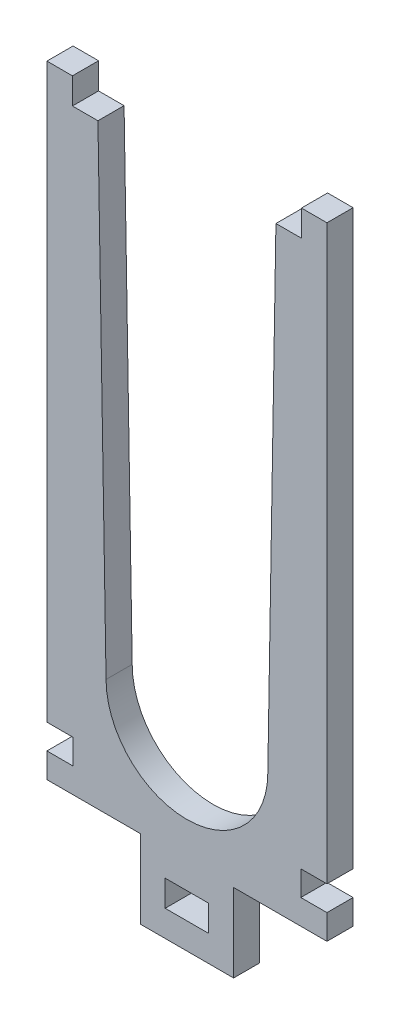
ISO-10303-21;
HEADER;
FILE_DESCRIPTION(('STEP AP214'),'2;1');
FILE_NAME('part.step','',(''),(''),'','','');
FILE_SCHEMA(('AUTOMOTIVE_DESIGN { 1 0 10303 214 1 1 1 1 }'));
ENDSEC;
DATA;
#1=APPLICATION_CONTEXT('core data for automotive mechanical design processes');
#2=APPLICATION_PROTOCOL_DEFINITION('international standard','automotive_design',2000,#1);
#3=PRODUCT_CONTEXT('',#1,'mechanical');
#4=PRODUCT('Part','Part','',(#3));
#5=PRODUCT_RELATED_PRODUCT_CATEGORY('part','',(#4));
#6=PRODUCT_DEFINITION_FORMATION('','',#4);
#7=PRODUCT_DEFINITION_CONTEXT('part definition',#1,'design');
#8=PRODUCT_DEFINITION('design','',#6,#7);
#9=PRODUCT_DEFINITION_SHAPE('','',#8);
#10=(LENGTH_UNIT() NAMED_UNIT(*) SI_UNIT(.MILLI.,.METRE.));
#11=(NAMED_UNIT(*) PLANE_ANGLE_UNIT() SI_UNIT($,.RADIAN.));
#12=(NAMED_UNIT(*) SI_UNIT($,.STERADIAN.) SOLID_ANGLE_UNIT());
#13=UNCERTAINTY_MEASURE_WITH_UNIT(LENGTH_MEASURE(1.E-05),#10,'distance_accuracy_value','');
#14=(GEOMETRIC_REPRESENTATION_CONTEXT(3) GLOBAL_UNCERTAINTY_ASSIGNED_CONTEXT((#13)) GLOBAL_UNIT_ASSIGNED_CONTEXT((#10,
#11,#12)) REPRESENTATION_CONTEXT('',''));
#15=CARTESIAN_POINT('',(0.,0.,0.));
#16=DIRECTION('',(0.,0.,1.));
#17=DIRECTION('',(1.,0.,0.));
#18=AXIS2_PLACEMENT_3D('',#15,#16,#17);
#19=CARTESIAN_POINT('',(57.15,0.,5.334));
#20=DIRECTION('',(-1.,0.,0.));
#21=DIRECTION('',(0.,-1.,0.));
#22=AXIS2_PLACEMENT_3D('',#19,#20,#21);
#23=PLANE('',#22);
#24=DIRECTION('',(0.,1.,0.));
#25=VECTOR('',#24,1.);
#26=CARTESIAN_POINT('',(57.15,0.,5.334));
#27=LINE('',#26,#25);
#28=CARTESIAN_POINT('',(57.15,15.494,5.334));
#29=VERTEX_POINT('',#28);
#30=CARTESIAN_POINT('',(57.15,132.334,5.334));
#31=VERTEX_POINT('',#30);
#32=EDGE_CURVE('E44',#29,#31,#27,.T.);
#33=ORIENTED_EDGE('',*,*,#32,.F.);
#34=DIRECTION('',(0.,0.,-1.));
#35=VECTOR('',#34,1.);
#36=CARTESIAN_POINT('',(57.15,15.494,5.334));
#37=LINE('',#36,#35);
#38=CARTESIAN_POINT('',(57.15,15.494,0.));
#39=VERTEX_POINT('',#38);
#40=EDGE_CURVE('E415',#29,#39,#37,.T.);
#41=ORIENTED_EDGE('',*,*,#40,.T.);
#42=DIRECTION('',(0.,1.,0.));
#43=VECTOR('',#42,1.);
#44=CARTESIAN_POINT('',(57.15,0.,0.));
#45=LINE('',#44,#43);
#46=CARTESIAN_POINT('',(57.15,132.334,0.));
#47=VERTEX_POINT('',#46);
#48=EDGE_CURVE('E309',#39,#47,#45,.T.);
#49=ORIENTED_EDGE('',*,*,#48,.T.);
#50=DIRECTION('',(0.,0.,-1.));
#51=VECTOR('',#50,1.);
#52=CARTESIAN_POINT('',(57.15,132.334,0.));
#53=LINE('',#52,#51);
#54=EDGE_CURVE('E391',#31,#47,#53,.T.);
#55=ORIENTED_EDGE('',*,*,#54,.F.);
#56=EDGE_LOOP('',(#33,#41,#49,#55));
#57=FACE_BOUND('',#56,.T.);
#58=ADVANCED_FACE('F35',(#57),#23,.F.);
#59=CARTESIAN_POINT('',(0.,0.,5.334));
#60=DIRECTION('',(1.,0.,0.));
#61=DIRECTION('',(0.,1.,0.));
#62=AXIS2_PLACEMENT_3D('',#59,#60,#61);
#63=PLANE('',#62);
#64=DIRECTION('',(0.,-1.,0.));
#65=VECTOR('',#64,1.);
#66=CARTESIAN_POINT('',(0.,0.,5.334));
#67=LINE('',#66,#65);
#68=CARTESIAN_POINT('',(0.,10.414,5.334));
#69=VERTEX_POINT('',#68);
#70=CARTESIAN_POINT('',(0.,5.334,5.334));
#71=VERTEX_POINT('',#70);
#72=EDGE_CURVE('E306',#69,#71,#67,.T.);
#73=ORIENTED_EDGE('',*,*,#72,.F.);
#74=DIRECTION('',(0.,0.,-1.));
#75=VECTOR('',#74,1.);
#76=CARTESIAN_POINT('',(0.,10.414,5.334));
#77=LINE('',#76,#75);
#78=CARTESIAN_POINT('',(0.,10.414,0.));
#79=VERTEX_POINT('',#78);
#80=EDGE_CURVE('E319',#69,#79,#77,.T.);
#81=ORIENTED_EDGE('',*,*,#80,.T.);
#82=DIRECTION('',(0.,-1.,0.));
#83=VECTOR('',#82,1.);
#84=CARTESIAN_POINT('',(0.,0.,0.));
#85=LINE('',#84,#83);
#86=CARTESIAN_POINT('',(0.,5.334,0.));
#87=VERTEX_POINT('',#86);
#88=EDGE_CURVE('E298',#79,#87,#85,.T.);
#89=ORIENTED_EDGE('',*,*,#88,.T.);
#90=DIRECTION('',(0.,0.,-1.));
#91=VECTOR('',#90,1.);
#92=CARTESIAN_POINT('',(0.,5.334,0.));
#93=LINE('',#92,#91);
#94=EDGE_CURVE('E261',#71,#87,#93,.T.);
#95=ORIENTED_EDGE('',*,*,#94,.F.);
#96=EDGE_LOOP('',(#73,#81,#89,#95));
#97=FACE_BOUND('',#96,.T.);
#98=ADVANCED_FACE('F318',(#97),#63,.F.);
#99=CARTESIAN_POINT('',(57.15,5.334,0.));
#100=VERTEX_POINT('',#99);
#101=CARTESIAN_POINT('',(57.15,10.414,0.));
#102=VERTEX_POINT('',#101);
#103=EDGE_CURVE('E39',#100,#102,#45,.T.);
#104=ORIENTED_EDGE('',*,*,#103,.T.);
#105=DIRECTION('',(0.,0.,-1.));
#106=VECTOR('',#105,1.);
#107=CARTESIAN_POINT('',(57.15,10.414,5.334));
#108=LINE('',#107,#106);
#109=CARTESIAN_POINT('',(57.15,10.414,5.334));
#110=VERTEX_POINT('',#109);
#111=EDGE_CURVE('E60',#110,#102,#108,.T.);
#112=ORIENTED_EDGE('',*,*,#111,.F.);
#113=CARTESIAN_POINT('',(57.15,5.334,5.334));
#114=VERTEX_POINT('',#113);
#115=EDGE_CURVE('E11',#114,#110,#27,.T.);
#116=ORIENTED_EDGE('',*,*,#115,.F.);
#117=DIRECTION('',(0.,0.,1.));
#118=VECTOR('',#117,1.);
#119=CARTESIAN_POINT('',(57.15,5.334,0.));
#120=LINE('',#119,#118);
#121=EDGE_CURVE('E248',#100,#114,#120,.T.);
#122=ORIENTED_EDGE('',*,*,#121,.F.);
#123=EDGE_LOOP('',(#104,#112,#116,#122));
#124=FACE_BOUND('',#123,.T.);
#125=ADVANCED_FACE('F234',(#124),#23,.F.);
#126=CARTESIAN_POINT('',(0.,132.334,0.));
#127=VERTEX_POINT('',#126);
#128=CARTESIAN_POINT('',(0.,15.494,0.));
#129=VERTEX_POINT('',#128);
#130=EDGE_CURVE('E307',#127,#129,#85,.T.);
#131=ORIENTED_EDGE('',*,*,#130,.T.);
#132=DIRECTION('',(0.,0.,-1.));
#133=VECTOR('',#132,1.);
#134=CARTESIAN_POINT('',(0.,15.494,5.334));
#135=LINE('',#134,#133);
#136=CARTESIAN_POINT('',(0.,15.494,5.334));
#137=VERTEX_POINT('',#136);
#138=EDGE_CURVE('E52',#137,#129,#135,.T.);
#139=ORIENTED_EDGE('',*,*,#138,.F.);
#140=CARTESIAN_POINT('',(0.,132.334,5.334));
#141=VERTEX_POINT('',#140);
#142=EDGE_CURVE('E304',#141,#137,#67,.T.);
#143=ORIENTED_EDGE('',*,*,#142,.F.);
#144=DIRECTION('',(0.,0.,1.));
#145=VECTOR('',#144,1.);
#146=CARTESIAN_POINT('',(0.,132.334,0.));
#147=LINE('',#146,#145);
#148=EDGE_CURVE('E366',#127,#141,#147,.T.);
#149=ORIENTED_EDGE('',*,*,#148,.F.);
#150=EDGE_LOOP('',(#131,#139,#143,#149));
#151=FACE_BOUND('',#150,.T.);
#152=ADVANCED_FACE('F37',(#151),#63,.F.);
#153=CARTESIAN_POINT('',(0.,0.,5.334));
#154=DIRECTION('',(0.,0.,-1.));
#155=DIRECTION('',(-1.,0.,0.));
#156=AXIS2_PLACEMENT_3D('',#153,#154,#155);
#157=PLANE('',#156);
#158=DIRECTION('',(1.,0.,0.));
#159=VECTOR('',#158,1.);
#160=CARTESIAN_POINT('',(33.02,0.,5.334));
#161=LINE('',#160,#159);
#162=CARTESIAN_POINT('',(24.13,0.,5.334));
#163=VERTEX_POINT('',#162);
#164=CARTESIAN_POINT('',(33.02,0.,5.334));
#165=VERTEX_POINT('',#164);
#166=EDGE_CURVE('E461',#163,#165,#161,.T.);
#167=ORIENTED_EDGE('',*,*,#166,.T.);
#168=DIRECTION('',(0.,-1.,0.));
#169=VECTOR('',#168,1.);
#170=CARTESIAN_POINT('',(33.02,0.,5.334));
#171=LINE('',#170,#169);
#172=CARTESIAN_POINT('',(33.02,-5.334,5.334));
#173=VERTEX_POINT('',#172);
#174=EDGE_CURVE('E451',#165,#173,#171,.T.);
#175=ORIENTED_EDGE('',*,*,#174,.T.);
#176=DIRECTION('',(-1.,0.,0.));
#177=VECTOR('',#176,1.);
#178=CARTESIAN_POINT('',(33.02,-5.334,5.334));
#179=LINE('',#178,#177);
#180=CARTESIAN_POINT('',(24.13,-5.334,5.334));
#181=VERTEX_POINT('',#180);
#182=EDGE_CURVE('E454',#173,#181,#179,.T.);
#183=ORIENTED_EDGE('',*,*,#182,.T.);
#184=DIRECTION('',(0.,1.,0.));
#185=VECTOR('',#184,1.);
#186=CARTESIAN_POINT('',(24.13,0.,5.334));
#187=LINE('',#186,#185);
#188=EDGE_CURVE('E458',#181,#163,#187,.T.);
#189=ORIENTED_EDGE('',*,*,#188,.T.);
#190=EDGE_LOOP('',(#167,#175,#183,#189));
#191=FACE_BOUND('',#190,.T.);
#192=DIRECTION('',(0.,1.,0.));
#193=VECTOR('',#192,1.);
#194=CARTESIAN_POINT('',(51.816,10.414,5.334));
#195=LINE('',#194,#193);
#196=CARTESIAN_POINT('',(51.816,10.414,5.334));
#197=VERTEX_POINT('',#196);
#198=CARTESIAN_POINT('',(51.816,15.494,5.334));
#199=VERTEX_POINT('',#198);
#200=EDGE_CURVE('E228',#197,#199,#195,.T.);
#201=ORIENTED_EDGE('',*,*,#200,.T.);
#202=DIRECTION('',(1.,0.,0.));
#203=VECTOR('',#202,1.);
#204=CARTESIAN_POINT('',(57.15,15.494,5.334));
#205=LINE('',#204,#203);
#206=EDGE_CURVE('E237',#199,#29,#205,.T.);
#207=ORIENTED_EDGE('',*,*,#206,.T.);
#208=ORIENTED_EDGE('',*,*,#32,.T.);
#209=DIRECTION('',(1.,0.,0.));
#210=VECTOR('',#209,1.);
#211=CARTESIAN_POINT('',(46.736,132.334,5.334));
#212=LINE('',#211,#210);
#213=CARTESIAN_POINT('',(51.943,132.334,5.334));
#214=VERTEX_POINT('',#213);
#215=EDGE_CURVE('E388',#214,#31,#212,.T.);
#216=ORIENTED_EDGE('',*,*,#215,.F.);
#217=DIRECTION('',(0.,1.,0.));
#218=VECTOR('',#217,1.);
#219=CARTESIAN_POINT('',(51.943,127.,5.334));
#220=LINE('',#219,#218);
#221=CARTESIAN_POINT('',(51.943,127.,5.334));
#222=VERTEX_POINT('',#221);
#223=EDGE_CURVE('E376',#222,#214,#220,.T.);
#224=ORIENTED_EDGE('',*,*,#223,.F.);
#225=DIRECTION('',(1.,0.,0.));
#226=VECTOR('',#225,1.);
#227=CARTESIAN_POINT('',(46.736,127.,5.334));
#228=LINE('',#227,#226);
#229=CARTESIAN_POINT('',(46.736,127.,5.334));
#230=VERTEX_POINT('',#229);
#231=EDGE_CURVE('E368',#230,#222,#228,.T.);
#232=ORIENTED_EDGE('',*,*,#231,.F.);
#233=DIRECTION('',(-0.0169080241525073,-0.999857049142155,0.));
#234=VECTOR('',#233,1.);
#235=CARTESIAN_POINT('',(44.5756269461976,-0.753793532451566,5.334));
#236=LINE('',#235,#234);
#237=CARTESIAN_POINT('',(45.0801802982121,29.083,5.334));
#238=VERTEX_POINT('',#237);
#239=EDGE_CURVE('E281',#230,#238,#236,.T.);
#240=ORIENTED_EDGE('',*,*,#239,.T.);
#241=CARTESIAN_POINT('',(28.575,29.083,5.334));
#242=DIRECTION('',(0.,0.,1.));
#243=DIRECTION('',(1.,0.,0.));
#244=AXIS2_PLACEMENT_3D('',#241,#242,#243);
#245=CIRCLE('',#244,16.5051802982121);
#246=CARTESIAN_POINT('',(12.0698197017879,29.083,5.334));
#247=VERTEX_POINT('',#246);
#248=EDGE_CURVE('E290',#247,#238,#245,.T.);
#249=ORIENTED_EDGE('',*,*,#248,.F.);
#250=DIRECTION('',(0.0169080241525077,-0.999857049142155,0.));
#251=VECTOR('',#250,1.);
#252=CARTESIAN_POINT('',(12.5580349386081,0.212361915367997,5.334));
#253=LINE('',#252,#251);
#254=CARTESIAN_POINT('',(10.414,127.,5.334));
#255=VERTEX_POINT('',#254);
#256=EDGE_CURVE('E259',#255,#247,#253,.T.);
#257=ORIENTED_EDGE('',*,*,#256,.F.);
#258=DIRECTION('',(1.,0.,0.));
#259=VECTOR('',#258,1.);
#260=CARTESIAN_POINT('',(10.414,127.,5.334));
#261=LINE('',#260,#259);
#262=CARTESIAN_POINT('',(5.20699999999999,127.,5.334));
#263=VERTEX_POINT('',#262);
#264=EDGE_CURVE('E358',#263,#255,#261,.T.);
#265=ORIENTED_EDGE('',*,*,#264,.F.);
#266=DIRECTION('',(0.,1.,0.));
#267=VECTOR('',#266,1.);
#268=CARTESIAN_POINT('',(5.20699999999999,127.,5.334));
#269=LINE('',#268,#267);
#270=CARTESIAN_POINT('',(5.20699999999999,132.334,5.334));
#271=VERTEX_POINT('',#270);
#272=EDGE_CURVE('E363',#263,#271,#269,.T.);
#273=ORIENTED_EDGE('',*,*,#272,.T.);
#274=DIRECTION('',(1.,0.,0.));
#275=VECTOR('',#274,1.);
#276=CARTESIAN_POINT('',(0.,132.334,5.334));
#277=LINE('',#276,#275);
#278=EDGE_CURVE('E383',#141,#271,#277,.T.);
#279=ORIENTED_EDGE('',*,*,#278,.F.);
#280=ORIENTED_EDGE('',*,*,#142,.T.);
#281=DIRECTION('',(1.,0.,0.));
#282=VECTOR('',#281,1.);
#283=CARTESIAN_POINT('',(0.,15.494,5.334));
#284=LINE('',#283,#282);
#285=CARTESIAN_POINT('',(5.334,15.494,5.334));
#286=VERTEX_POINT('',#285);
#287=EDGE_CURVE('E431',#137,#286,#284,.T.);
#288=ORIENTED_EDGE('',*,*,#287,.T.);
#289=DIRECTION('',(0.,-1.,0.));
#290=VECTOR('',#289,1.);
#291=CARTESIAN_POINT('',(5.334,10.414,5.334));
#292=LINE('',#291,#290);
#293=CARTESIAN_POINT('',(5.334,10.414,5.334));
#294=VERTEX_POINT('',#293);
#295=EDGE_CURVE('E435',#286,#294,#292,.T.);
#296=ORIENTED_EDGE('',*,*,#295,.T.);
#297=DIRECTION('',(-1.,0.,0.));
#298=VECTOR('',#297,1.);
#299=CARTESIAN_POINT('',(0.,10.414,5.334));
#300=LINE('',#299,#298);
#301=EDGE_CURVE('E428',#294,#69,#300,.T.);
#302=ORIENTED_EDGE('',*,*,#301,.T.);
#303=ORIENTED_EDGE('',*,*,#72,.T.);
#304=DIRECTION('',(-1.,0.,0.));
#305=VECTOR('',#304,1.);
#306=CARTESIAN_POINT('',(0.,5.334,5.334));
#307=LINE('',#306,#305);
#308=CARTESIAN_POINT('',(19.05,5.334,5.334));
#309=VERTEX_POINT('',#308);
#310=EDGE_CURVE('E271',#309,#71,#307,.T.);
#311=ORIENTED_EDGE('',*,*,#310,.F.);
#312=DIRECTION('',(0.,-1.,0.));
#313=VECTOR('',#312,1.);
#314=CARTESIAN_POINT('',(19.05,5.334,5.334));
#315=LINE('',#314,#313);
#316=CARTESIAN_POINT('',(19.05,-10.668,5.334));
#317=VERTEX_POINT('',#316);
#318=EDGE_CURVE('E252',#309,#317,#315,.T.);
#319=ORIENTED_EDGE('',*,*,#318,.T.);
#320=DIRECTION('',(-1.,0.,0.));
#321=VECTOR('',#320,1.);
#322=CARTESIAN_POINT('',(38.1,-10.668,5.334));
#323=LINE('',#322,#321);
#324=CARTESIAN_POINT('',(38.1,-10.668,5.334));
#325=VERTEX_POINT('',#324);
#326=EDGE_CURVE('E343',#325,#317,#323,.T.);
#327=ORIENTED_EDGE('',*,*,#326,.F.);
#328=DIRECTION('',(0.,-1.,0.));
#329=VECTOR('',#328,1.);
#330=CARTESIAN_POINT('',(38.1,5.334,5.334));
#331=LINE('',#330,#329);
#332=CARTESIAN_POINT('',(38.1,5.334,5.334));
#333=VERTEX_POINT('',#332);
#334=EDGE_CURVE('E245',#333,#325,#331,.T.);
#335=ORIENTED_EDGE('',*,*,#334,.F.);
#336=DIRECTION('',(-1.,0.,0.));
#337=VECTOR('',#336,1.);
#338=CARTESIAN_POINT('',(57.15,5.334,5.334));
#339=LINE('',#338,#337);
#340=EDGE_CURVE('E243',#114,#333,#339,.T.);
#341=ORIENTED_EDGE('',*,*,#340,.F.);
#342=ORIENTED_EDGE('',*,*,#115,.T.);
#343=DIRECTION('',(-1.,0.,0.));
#344=VECTOR('',#343,1.);
#345=CARTESIAN_POINT('',(57.15,10.414,5.334));
#346=LINE('',#345,#344);
#347=EDGE_CURVE('E222',#110,#197,#346,.T.);
#348=ORIENTED_EDGE('',*,*,#347,.T.);
#349=EDGE_LOOP('',(#201,#207,#208,#216,#224,#232,#240,#249,#257,#265,#273,#279,#280,#288,#296,
#302,#303,#311,#319,#327,#335,#341,#342,#348));
#350=FACE_BOUND('',#349,.T.);
#351=ADVANCED_FACE('F240',(#191,#350),#157,.F.);
#352=CARTESIAN_POINT('',(0.,0.,0.));
#353=DIRECTION('',(0.,0.,-1.));
#354=DIRECTION('',(-1.,0.,0.));
#355=AXIS2_PLACEMENT_3D('',#352,#353,#354);
#356=PLANE('',#355);
#357=DIRECTION('',(1.,0.,0.));
#358=VECTOR('',#357,1.);
#359=CARTESIAN_POINT('',(57.15,15.494,0.));
#360=LINE('',#359,#358);
#361=CARTESIAN_POINT('',(51.816,15.494,0.));
#362=VERTEX_POINT('',#361);
#363=EDGE_CURVE('E229',#362,#39,#360,.T.);
#364=ORIENTED_EDGE('',*,*,#363,.F.);
#365=DIRECTION('',(0.,1.,0.));
#366=VECTOR('',#365,1.);
#367=CARTESIAN_POINT('',(51.816,10.414,0.));
#368=LINE('',#367,#366);
#369=CARTESIAN_POINT('',(51.816,10.414,0.));
#370=VERTEX_POINT('',#369);
#371=EDGE_CURVE('E619',#370,#362,#368,.T.);
#372=ORIENTED_EDGE('',*,*,#371,.F.);
#373=DIRECTION('',(-1.,0.,0.));
#374=VECTOR('',#373,1.);
#375=CARTESIAN_POINT('',(57.15,10.414,0.));
#376=LINE('',#375,#374);
#377=EDGE_CURVE('E446',#102,#370,#376,.T.);
#378=ORIENTED_EDGE('',*,*,#377,.F.);
#379=ORIENTED_EDGE('',*,*,#103,.F.);
#380=DIRECTION('',(1.,0.,0.));
#381=VECTOR('',#380,1.);
#382=CARTESIAN_POINT('',(57.15,5.334,0.));
#383=LINE('',#382,#381);
#384=CARTESIAN_POINT('',(38.1,5.334,0.));
#385=VERTEX_POINT('',#384);
#386=EDGE_CURVE('E250',#385,#100,#383,.T.);
#387=ORIENTED_EDGE('',*,*,#386,.F.);
#388=DIRECTION('',(0.,-1.,0.));
#389=VECTOR('',#388,1.);
#390=CARTESIAN_POINT('',(38.1,5.334,0.));
#391=LINE('',#390,#389);
#392=CARTESIAN_POINT('',(38.1,-10.668,0.));
#393=VERTEX_POINT('',#392);
#394=EDGE_CURVE('E257',#385,#393,#391,.T.);
#395=ORIENTED_EDGE('',*,*,#394,.T.);
#396=DIRECTION('',(1.,0.,0.));
#397=VECTOR('',#396,1.);
#398=CARTESIAN_POINT('',(38.1,-10.668,0.));
#399=LINE('',#398,#397);
#400=CARTESIAN_POINT('',(19.05,-10.668,0.));
#401=VERTEX_POINT('',#400);
#402=EDGE_CURVE('E332',#401,#393,#399,.T.);
#403=ORIENTED_EDGE('',*,*,#402,.F.);
#404=DIRECTION('',(0.,-1.,0.));
#405=VECTOR('',#404,1.);
#406=CARTESIAN_POINT('',(19.05,5.334,0.));
#407=LINE('',#406,#405);
#408=CARTESIAN_POINT('',(19.05,5.334,0.));
#409=VERTEX_POINT('',#408);
#410=EDGE_CURVE('E274',#409,#401,#407,.T.);
#411=ORIENTED_EDGE('',*,*,#410,.F.);
#412=DIRECTION('',(1.,0.,0.));
#413=VECTOR('',#412,1.);
#414=CARTESIAN_POINT('',(0.,5.334,0.));
#415=LINE('',#414,#413);
#416=EDGE_CURVE('E264',#87,#409,#415,.T.);
#417=ORIENTED_EDGE('',*,*,#416,.F.);
#418=ORIENTED_EDGE('',*,*,#88,.F.);
#419=DIRECTION('',(-1.,0.,0.));
#420=VECTOR('',#419,1.);
#421=CARTESIAN_POINT('',(0.,10.414,0.));
#422=LINE('',#421,#420);
#423=CARTESIAN_POINT('',(5.334,10.414,0.));
#424=VERTEX_POINT('',#423);
#425=EDGE_CURVE('E438',#424,#79,#422,.T.);
#426=ORIENTED_EDGE('',*,*,#425,.F.);
#427=DIRECTION('',(0.,-1.,0.));
#428=VECTOR('',#427,1.);
#429=CARTESIAN_POINT('',(5.334,10.414,0.));
#430=LINE('',#429,#428);
#431=CARTESIAN_POINT('',(5.334,15.494,0.));
#432=VERTEX_POINT('',#431);
#433=EDGE_CURVE('E432',#432,#424,#430,.T.);
#434=ORIENTED_EDGE('',*,*,#433,.F.);
#435=DIRECTION('',(1.,0.,0.));
#436=VECTOR('',#435,1.);
#437=CARTESIAN_POINT('',(0.,15.494,0.));
#438=LINE('',#437,#436);
#439=EDGE_CURVE('E440',#129,#432,#438,.T.);
#440=ORIENTED_EDGE('',*,*,#439,.F.);
#441=ORIENTED_EDGE('',*,*,#130,.F.);
#442=DIRECTION('',(-1.,0.,0.));
#443=VECTOR('',#442,1.);
#444=CARTESIAN_POINT('',(0.,132.334,0.));
#445=LINE('',#444,#443);
#446=CARTESIAN_POINT('',(5.20699999999999,132.334,0.));
#447=VERTEX_POINT('',#446);
#448=EDGE_CURVE('E386',#447,#127,#445,.T.);
#449=ORIENTED_EDGE('',*,*,#448,.F.);
#450=DIRECTION('',(0.,1.,0.));
#451=VECTOR('',#450,1.);
#452=CARTESIAN_POINT('',(5.20699999999999,127.,0.));
#453=LINE('',#452,#451);
#454=CARTESIAN_POINT('',(5.20699999999999,127.,0.));
#455=VERTEX_POINT('',#454);
#456=EDGE_CURVE('E360',#455,#447,#453,.T.);
#457=ORIENTED_EDGE('',*,*,#456,.F.);
#458=DIRECTION('',(-1.,0.,0.));
#459=VECTOR('',#458,1.);
#460=CARTESIAN_POINT('',(10.414,127.,0.));
#461=LINE('',#460,#459);
#462=CARTESIAN_POINT('',(10.414,127.,0.));
#463=VERTEX_POINT('',#462);
#464=EDGE_CURVE('E351',#463,#455,#461,.T.);
#465=ORIENTED_EDGE('',*,*,#464,.F.);
#466=DIRECTION('',(0.0169080241525077,-0.999857049142155,0.));
#467=VECTOR('',#466,1.);
#468=CARTESIAN_POINT('',(12.5580349386081,0.212361915367997,0.));
#469=LINE('',#468,#467);
#470=CARTESIAN_POINT('',(12.0698197017879,29.083,0.));
#471=VERTEX_POINT('',#470);
#472=EDGE_CURVE('E277',#463,#471,#469,.T.);
#473=ORIENTED_EDGE('',*,*,#472,.T.);
#474=CARTESIAN_POINT('',(28.575,29.083,0.));
#475=DIRECTION('',(0.,0.,1.));
#476=DIRECTION('',(1.,0.,0.));
#477=AXIS2_PLACEMENT_3D('',#474,#475,#476);
#478=CIRCLE('',#477,16.5051802982121);
#479=CARTESIAN_POINT('',(45.0801802982121,29.083,0.));
#480=VERTEX_POINT('',#479);
#481=EDGE_CURVE('E280',#471,#480,#478,.T.);
#482=ORIENTED_EDGE('',*,*,#481,.T.);
#483=DIRECTION('',(-0.0169080241525073,-0.999857049142155,0.));
#484=VECTOR('',#483,1.);
#485=CARTESIAN_POINT('',(44.5756269461976,-0.753793532451566,0.));
#486=LINE('',#485,#484);
#487=CARTESIAN_POINT('',(46.736,127.,0.));
#488=VERTEX_POINT('',#487);
#489=EDGE_CURVE('E284',#488,#480,#486,.T.);
#490=ORIENTED_EDGE('',*,*,#489,.F.);
#491=DIRECTION('',(-1.,0.,0.));
#492=VECTOR('',#491,1.);
#493=CARTESIAN_POINT('',(46.736,127.,0.));
#494=LINE('',#493,#492);
#495=CARTESIAN_POINT('',(51.943,127.,0.));
#496=VERTEX_POINT('',#495);
#497=EDGE_CURVE('E374',#496,#488,#494,.T.);
#498=ORIENTED_EDGE('',*,*,#497,.F.);
#499=DIRECTION('',(0.,1.,0.));
#500=VECTOR('',#499,1.);
#501=CARTESIAN_POINT('',(51.943,127.,0.));
#502=LINE('',#501,#500);
#503=CARTESIAN_POINT('',(51.943,132.334,0.));
#504=VERTEX_POINT('',#503);
#505=EDGE_CURVE('E362',#496,#504,#502,.T.);
#506=ORIENTED_EDGE('',*,*,#505,.T.);
#507=DIRECTION('',(-1.,0.,0.));
#508=VECTOR('',#507,1.);
#509=CARTESIAN_POINT('',(46.736,132.334,0.));
#510=LINE('',#509,#508);
#511=EDGE_CURVE('E265',#47,#504,#510,.T.);
#512=ORIENTED_EDGE('',*,*,#511,.F.);
#513=ORIENTED_EDGE('',*,*,#48,.F.);
#514=EDGE_LOOP('',(#364,#372,#378,#379,#387,#395,#403,#411,#417,#418,#426,#434,#440,#441,#449,
#457,#465,#473,#482,#490,#498,#506,#512,#513));
#515=FACE_BOUND('',#514,.T.);
#516=DIRECTION('',(0.,-1.,0.));
#517=VECTOR('',#516,1.);
#518=CARTESIAN_POINT('',(33.02,0.,0.));
#519=LINE('',#518,#517);
#520=CARTESIAN_POINT('',(33.02,0.,0.));
#521=VERTEX_POINT('',#520);
#522=CARTESIAN_POINT('',(33.02,-5.334,0.));
#523=VERTEX_POINT('',#522);
#524=EDGE_CURVE('E418',#521,#523,#519,.T.);
#525=ORIENTED_EDGE('',*,*,#524,.F.);
#526=DIRECTION('',(1.,0.,0.));
#527=VECTOR('',#526,1.);
#528=CARTESIAN_POINT('',(33.02,0.,0.));
#529=LINE('',#528,#527);
#530=CARTESIAN_POINT('',(24.13,0.,0.));
#531=VERTEX_POINT('',#530);
#532=EDGE_CURVE('E455',#531,#521,#529,.T.);
#533=ORIENTED_EDGE('',*,*,#532,.F.);
#534=DIRECTION('',(0.,1.,0.));
#535=VECTOR('',#534,1.);
#536=CARTESIAN_POINT('',(24.13,0.,0.));
#537=LINE('',#536,#535);
#538=CARTESIAN_POINT('',(24.13,-5.334,0.));
#539=VERTEX_POINT('',#538);
#540=EDGE_CURVE('E467',#539,#531,#537,.T.);
#541=ORIENTED_EDGE('',*,*,#540,.F.);
#542=DIRECTION('',(-1.,0.,0.));
#543=VECTOR('',#542,1.);
#544=CARTESIAN_POINT('',(33.02,-5.334,0.));
#545=LINE('',#544,#543);
#546=EDGE_CURVE('E421',#523,#539,#545,.T.);
#547=ORIENTED_EDGE('',*,*,#546,.F.);
#548=EDGE_LOOP('',(#525,#533,#541,#547));
#549=FACE_BOUND('',#548,.T.);
#550=ADVANCED_FACE('F328',(#515,#549),#356,.T.);
#551=CARTESIAN_POINT('',(12.5580349386081,0.212361915367997,0.));
#552=DIRECTION('',(-0.999857049142155,-0.0169080241525077,0.));
#553=DIRECTION('',(0.0169080241525077,-0.999857049142155,0.));
#554=AXIS2_PLACEMENT_3D('',#551,#552,#553);
#555=PLANE('',#554);
#556=ORIENTED_EDGE('',*,*,#256,.T.);
#557=DIRECTION('',(0.,0.,1.));
#558=VECTOR('',#557,1.);
#559=CARTESIAN_POINT('',(12.0698197017879,29.083,0.));
#560=LINE('',#559,#558);
#561=EDGE_CURVE('E287',#471,#247,#560,.T.);
#562=ORIENTED_EDGE('',*,*,#561,.F.);
#563=ORIENTED_EDGE('',*,*,#472,.F.);
#564=DIRECTION('',(0.,0.,1.));
#565=VECTOR('',#564,1.);
#566=CARTESIAN_POINT('',(10.414,127.,0.));
#567=LINE('',#566,#565);
#568=EDGE_CURVE('E295',#463,#255,#567,.T.);
#569=ORIENTED_EDGE('',*,*,#568,.T.);
#570=EDGE_LOOP('',(#556,#562,#563,#569));
#571=FACE_BOUND('',#570,.T.);
#572=ADVANCED_FACE('F519',(#571),#555,.F.);
#573=CARTESIAN_POINT('',(44.5756269461976,-0.753793532451566,0.));
#574=DIRECTION('',(-0.999857049142155,0.0169080241525073,0.));
#575=DIRECTION('',(-0.0169080241525073,-0.999857049142155,0.));
#576=AXIS2_PLACEMENT_3D('',#573,#574,#575);
#577=PLANE('',#576);
#578=ORIENTED_EDGE('',*,*,#239,.F.);
#579=DIRECTION('',(0.,0.,1.));
#580=VECTOR('',#579,1.);
#581=CARTESIAN_POINT('',(46.736,127.,0.));
#582=LINE('',#581,#580);
#583=EDGE_CURVE('E299',#488,#230,#582,.T.);
#584=ORIENTED_EDGE('',*,*,#583,.F.);
#585=ORIENTED_EDGE('',*,*,#489,.T.);
#586=DIRECTION('',(0.,0.,1.));
#587=VECTOR('',#586,1.);
#588=CARTESIAN_POINT('',(45.0801802982121,29.083,0.));
#589=LINE('',#588,#587);
#590=EDGE_CURVE('E301',#480,#238,#589,.T.);
#591=ORIENTED_EDGE('',*,*,#590,.T.);
#592=EDGE_LOOP('',(#578,#584,#585,#591));
#593=FACE_BOUND('',#592,.T.);
#594=ADVANCED_FACE('F523',(#593),#577,.T.);
#595=CARTESIAN_POINT('',(28.575,29.083,0.));
#596=DIRECTION('',(0.,0.,1.));
#597=DIRECTION('',(1.,0.,0.));
#598=AXIS2_PLACEMENT_3D('',#595,#596,#597);
#599=CYLINDRICAL_SURFACE('',#598,16.5051802982121);
#600=ORIENTED_EDGE('',*,*,#248,.T.);
#601=ORIENTED_EDGE('',*,*,#590,.F.);
#602=ORIENTED_EDGE('',*,*,#481,.F.);
#603=ORIENTED_EDGE('',*,*,#561,.T.);
#604=EDGE_LOOP('',(#600,#601,#602,#603));
#605=FACE_BOUND('',#604,.T.);
#606=ADVANCED_FACE('F525',(#605),#599,.F.);
#607=CARTESIAN_POINT('',(19.05,5.334,0.));
#608=DIRECTION('',(1.,0.,0.));
#609=DIRECTION('',(0.,0.,-1.));
#610=AXIS2_PLACEMENT_3D('',#607,#608,#609);
#611=PLANE('',#610);
#612=ORIENTED_EDGE('',*,*,#410,.T.);
#613=DIRECTION('',(0.,0.,-1.));
#614=VECTOR('',#613,1.);
#615=CARTESIAN_POINT('',(19.05,-10.668,0.));
#616=LINE('',#615,#614);
#617=EDGE_CURVE('E337',#317,#401,#616,.T.);
#618=ORIENTED_EDGE('',*,*,#617,.F.);
#619=ORIENTED_EDGE('',*,*,#318,.F.);
#620=DIRECTION('',(0.,0.,1.));
#621=VECTOR('',#620,1.);
#622=CARTESIAN_POINT('',(19.05,5.334,0.));
#623=LINE('',#622,#621);
#624=EDGE_CURVE('E268',#409,#309,#623,.T.);
#625=ORIENTED_EDGE('',*,*,#624,.F.);
#626=EDGE_LOOP('',(#612,#618,#619,#625));
#627=FACE_BOUND('',#626,.T.);
#628=ADVANCED_FACE('F336',(#627),#611,.F.);
#629=CARTESIAN_POINT('',(0.,5.334,0.));
#630=DIRECTION('',(0.,1.,0.));
#631=DIRECTION('',(0.,0.,1.));
#632=AXIS2_PLACEMENT_3D('',#629,#630,#631);
#633=PLANE('',#632);
#634=ORIENTED_EDGE('',*,*,#94,.T.);
#635=ORIENTED_EDGE('',*,*,#416,.T.);
#636=ORIENTED_EDGE('',*,*,#624,.T.);
#637=ORIENTED_EDGE('',*,*,#310,.T.);
#638=EDGE_LOOP('',(#634,#635,#636,#637));
#639=FACE_BOUND('',#638,.T.);
#640=ADVANCED_FACE('F324',(#639),#633,.F.);
#641=CARTESIAN_POINT('',(38.1,5.334,0.));
#642=DIRECTION('',(-1.,0.,0.));
#643=DIRECTION('',(0.,0.,1.));
#644=AXIS2_PLACEMENT_3D('',#641,#642,#643);
#645=PLANE('',#644);
#646=ORIENTED_EDGE('',*,*,#334,.T.);
#647=DIRECTION('',(0.,0.,1.));
#648=VECTOR('',#647,1.);
#649=CARTESIAN_POINT('',(38.1,-10.668,0.));
#650=LINE('',#649,#648);
#651=EDGE_CURVE('E347',#393,#325,#650,.T.);
#652=ORIENTED_EDGE('',*,*,#651,.F.);
#653=ORIENTED_EDGE('',*,*,#394,.F.);
#654=DIRECTION('',(0.,0.,-1.));
#655=VECTOR('',#654,1.);
#656=CARTESIAN_POINT('',(38.1,5.334,0.));
#657=LINE('',#656,#655);
#658=EDGE_CURVE('E247',#333,#385,#657,.T.);
#659=ORIENTED_EDGE('',*,*,#658,.F.);
#660=EDGE_LOOP('',(#646,#652,#653,#659));
#661=FACE_BOUND('',#660,.T.);
#662=ADVANCED_FACE('F481',(#661),#645,.F.);
#663=CARTESIAN_POINT('',(0.,5.334,0.));
#664=DIRECTION('',(0.,-1.,0.));
#665=DIRECTION('',(0.,0.,-1.));
#666=AXIS2_PLACEMENT_3D('',#663,#664,#665);
#667=PLANE('',#666);
#668=ORIENTED_EDGE('',*,*,#121,.T.);
#669=ORIENTED_EDGE('',*,*,#340,.T.);
#670=ORIENTED_EDGE('',*,*,#658,.T.);
#671=ORIENTED_EDGE('',*,*,#386,.T.);
#672=EDGE_LOOP('',(#668,#669,#670,#671));
#673=FACE_BOUND('',#672,.T.);
#674=ADVANCED_FACE('F538',(#673),#667,.T.);
#675=CARTESIAN_POINT('',(0.,132.334,0.));
#676=DIRECTION('',(0.,1.,0.));
#677=DIRECTION('',(0.,0.,1.));
#678=AXIS2_PLACEMENT_3D('',#675,#676,#677);
#679=PLANE('',#678);
#680=DIRECTION('',(0.,0.,-1.));
#681=VECTOR('',#680,1.);
#682=CARTESIAN_POINT('',(51.943,132.334,0.));
#683=LINE('',#682,#681);
#684=EDGE_CURVE('E345',#214,#504,#683,.T.);
#685=ORIENTED_EDGE('',*,*,#684,.F.);
#686=ORIENTED_EDGE('',*,*,#215,.T.);
#687=ORIENTED_EDGE('',*,*,#54,.T.);
#688=ORIENTED_EDGE('',*,*,#511,.T.);
#689=EDGE_LOOP('',(#685,#686,#687,#688));
#690=FACE_BOUND('',#689,.T.);
#691=ADVANCED_FACE('F397',(#690),#679,.T.);
#692=CARTESIAN_POINT('',(0.,132.334,0.));
#693=DIRECTION('',(0.,1.,0.));
#694=DIRECTION('',(0.,0.,1.));
#695=AXIS2_PLACEMENT_3D('',#692,#693,#694);
#696=PLANE('',#695);
#697=DIRECTION('',(0.,0.,1.));
#698=VECTOR('',#697,1.);
#699=CARTESIAN_POINT('',(5.20699999999999,132.334,0.));
#700=LINE('',#699,#698);
#701=EDGE_CURVE('E355',#447,#271,#700,.T.);
#702=ORIENTED_EDGE('',*,*,#701,.F.);
#703=ORIENTED_EDGE('',*,*,#448,.T.);
#704=ORIENTED_EDGE('',*,*,#148,.T.);
#705=ORIENTED_EDGE('',*,*,#278,.T.);
#706=EDGE_LOOP('',(#702,#703,#704,#705));
#707=FACE_BOUND('',#706,.T.);
#708=ADVANCED_FACE('F543',(#707),#696,.T.);
#709=CARTESIAN_POINT('',(5.20699999999999,127.,0.));
#710=DIRECTION('',(-1.,0.,0.));
#711=DIRECTION('',(0.,0.,1.));
#712=AXIS2_PLACEMENT_3D('',#709,#710,#711);
#713=PLANE('',#712);
#714=ORIENTED_EDGE('',*,*,#701,.T.);
#715=ORIENTED_EDGE('',*,*,#272,.F.);
#716=DIRECTION('',(0.,0.,1.));
#717=VECTOR('',#716,1.);
#718=CARTESIAN_POINT('',(5.20699999999999,127.,0.));
#719=LINE('',#718,#717);
#720=EDGE_CURVE('E354',#455,#263,#719,.T.);
#721=ORIENTED_EDGE('',*,*,#720,.F.);
#722=ORIENTED_EDGE('',*,*,#456,.T.);
#723=EDGE_LOOP('',(#714,#715,#721,#722));
#724=FACE_BOUND('',#723,.T.);
#725=ADVANCED_FACE('F546',(#724),#713,.F.);
#726=CARTESIAN_POINT('',(0.,127.,0.));
#727=DIRECTION('',(0.,-1.,0.));
#728=DIRECTION('',(0.,0.,-1.));
#729=AXIS2_PLACEMENT_3D('',#726,#727,#728);
#730=PLANE('',#729);
#731=ORIENTED_EDGE('',*,*,#568,.F.);
#732=ORIENTED_EDGE('',*,*,#464,.T.);
#733=ORIENTED_EDGE('',*,*,#720,.T.);
#734=ORIENTED_EDGE('',*,*,#264,.T.);
#735=EDGE_LOOP('',(#731,#732,#733,#734));
#736=FACE_BOUND('',#735,.T.);
#737=ADVANCED_FACE('F550',(#736),#730,.F.);
#738=CARTESIAN_POINT('',(51.943,127.,0.));
#739=DIRECTION('',(1.,0.,0.));
#740=DIRECTION('',(0.,0.,-1.));
#741=AXIS2_PLACEMENT_3D('',#738,#739,#740);
#742=PLANE('',#741);
#743=ORIENTED_EDGE('',*,*,#684,.T.);
#744=ORIENTED_EDGE('',*,*,#505,.F.);
#745=DIRECTION('',(0.,0.,-1.));
#746=VECTOR('',#745,1.);
#747=CARTESIAN_POINT('',(51.943,127.,0.));
#748=LINE('',#747,#746);
#749=EDGE_CURVE('E371',#222,#496,#748,.T.);
#750=ORIENTED_EDGE('',*,*,#749,.F.);
#751=ORIENTED_EDGE('',*,*,#223,.T.);
#752=EDGE_LOOP('',(#743,#744,#750,#751));
#753=FACE_BOUND('',#752,.T.);
#754=ADVANCED_FACE('F404',(#753),#742,.F.);
#755=CARTESIAN_POINT('',(0.,127.,0.));
#756=DIRECTION('',(0.,1.,0.));
#757=DIRECTION('',(0.,0.,1.));
#758=AXIS2_PLACEMENT_3D('',#755,#756,#757);
#759=PLANE('',#758);
#760=ORIENTED_EDGE('',*,*,#583,.T.);
#761=ORIENTED_EDGE('',*,*,#231,.T.);
#762=ORIENTED_EDGE('',*,*,#749,.T.);
#763=ORIENTED_EDGE('',*,*,#497,.T.);
#764=EDGE_LOOP('',(#760,#761,#762,#763));
#765=FACE_BOUND('',#764,.T.);
#766=ADVANCED_FACE('F406',(#765),#759,.T.);
#767=CARTESIAN_POINT('',(0.,-10.668,0.));
#768=DIRECTION('',(0.,-1.,0.));
#769=DIRECTION('',(0.,0.,-1.));
#770=AXIS2_PLACEMENT_3D('',#767,#768,#769);
#771=PLANE('',#770);
#772=ORIENTED_EDGE('',*,*,#651,.T.);
#773=ORIENTED_EDGE('',*,*,#326,.T.);
#774=ORIENTED_EDGE('',*,*,#617,.T.);
#775=ORIENTED_EDGE('',*,*,#402,.T.);
#776=EDGE_LOOP('',(#772,#773,#774,#775));
#777=FACE_BOUND('',#776,.T.);
#778=ADVANCED_FACE('F341',(#777),#771,.T.);
#779=CARTESIAN_POINT('',(33.02,0.,5.334));
#780=DIRECTION('',(1.,0.,0.));
#781=DIRECTION('',(0.,0.,-1.));
#782=AXIS2_PLACEMENT_3D('',#779,#780,#781);
#783=PLANE('',#782);
#784=ORIENTED_EDGE('',*,*,#524,.T.);
#785=DIRECTION('',(0.,0.,-1.));
#786=VECTOR('',#785,1.);
#787=CARTESIAN_POINT('',(33.02,-5.334,5.334));
#788=LINE('',#787,#786);
#789=EDGE_CURVE('E463',#173,#523,#788,.T.);
#790=ORIENTED_EDGE('',*,*,#789,.F.);
#791=ORIENTED_EDGE('',*,*,#174,.F.);
#792=DIRECTION('',(0.,0.,-1.));
#793=VECTOR('',#792,1.);
#794=CARTESIAN_POINT('',(33.02,0.,5.334));
#795=LINE('',#794,#793);
#796=EDGE_CURVE('E472',#165,#521,#795,.T.);
#797=ORIENTED_EDGE('',*,*,#796,.T.);
#798=EDGE_LOOP('',(#784,#790,#791,#797));
#799=FACE_BOUND('',#798,.T.);
#800=ADVANCED_FACE('F561',(#799),#783,.F.);
#801=CARTESIAN_POINT('',(33.02,0.,5.334));
#802=DIRECTION('',(0.,1.,0.));
#803=DIRECTION('',(0.,0.,1.));
#804=AXIS2_PLACEMENT_3D('',#801,#802,#803);
#805=PLANE('',#804);
#806=ORIENTED_EDGE('',*,*,#532,.T.);
#807=ORIENTED_EDGE('',*,*,#796,.F.);
#808=ORIENTED_EDGE('',*,*,#166,.F.);
#809=DIRECTION('',(0.,0.,-1.));
#810=VECTOR('',#809,1.);
#811=CARTESIAN_POINT('',(24.13,0.,5.334));
#812=LINE('',#811,#810);
#813=EDGE_CURVE('E474',#163,#531,#812,.T.);
#814=ORIENTED_EDGE('',*,*,#813,.T.);
#815=EDGE_LOOP('',(#806,#807,#808,#814));
#816=FACE_BOUND('',#815,.T.);
#817=ADVANCED_FACE('F564',(#816),#805,.F.);
#818=CARTESIAN_POINT('',(24.13,0.,5.334));
#819=DIRECTION('',(-1.,0.,0.));
#820=DIRECTION('',(0.,0.,1.));
#821=AXIS2_PLACEMENT_3D('',#818,#819,#820);
#822=PLANE('',#821);
#823=ORIENTED_EDGE('',*,*,#540,.T.);
#824=ORIENTED_EDGE('',*,*,#813,.F.);
#825=ORIENTED_EDGE('',*,*,#188,.F.);
#826=DIRECTION('',(0.,0.,-1.));
#827=VECTOR('',#826,1.);
#828=CARTESIAN_POINT('',(24.13,-5.334,5.334));
#829=LINE('',#828,#827);
#830=EDGE_CURVE('E476',#181,#539,#829,.T.);
#831=ORIENTED_EDGE('',*,*,#830,.T.);
#832=EDGE_LOOP('',(#823,#824,#825,#831));
#833=FACE_BOUND('',#832,.T.);
#834=ADVANCED_FACE('F569',(#833),#822,.F.);
#835=CARTESIAN_POINT('',(33.02,-5.334,5.334));
#836=DIRECTION('',(0.,-1.,0.));
#837=DIRECTION('',(0.,0.,-1.));
#838=AXIS2_PLACEMENT_3D('',#835,#836,#837);
#839=PLANE('',#838);
#840=ORIENTED_EDGE('',*,*,#546,.T.);
#841=ORIENTED_EDGE('',*,*,#830,.F.);
#842=ORIENTED_EDGE('',*,*,#182,.F.);
#843=ORIENTED_EDGE('',*,*,#789,.T.);
#844=EDGE_LOOP('',(#840,#841,#842,#843));
#845=FACE_BOUND('',#844,.T.);
#846=ADVANCED_FACE('F566',(#845),#839,.F.);
#847=CARTESIAN_POINT('',(0.,10.414,5.334));
#848=DIRECTION('',(0.,-1.,0.));
#849=DIRECTION('',(0.,0.,-1.));
#850=AXIS2_PLACEMENT_3D('',#847,#848,#849);
#851=PLANE('',#850);
#852=ORIENTED_EDGE('',*,*,#425,.T.);
#853=ORIENTED_EDGE('',*,*,#80,.F.);
#854=ORIENTED_EDGE('',*,*,#301,.F.);
#855=DIRECTION('',(0.,0.,-1.));
#856=VECTOR('',#855,1.);
#857=CARTESIAN_POINT('',(5.334,10.414,5.334));
#858=LINE('',#857,#856);
#859=EDGE_CURVE('E444',#294,#424,#858,.T.);
#860=ORIENTED_EDGE('',*,*,#859,.T.);
#861=EDGE_LOOP('',(#852,#853,#854,#860));
#862=FACE_BOUND('',#861,.T.);
#863=ADVANCED_FACE('F486',(#862),#851,.F.);
#864=CARTESIAN_POINT('',(5.334,10.414,5.334));
#865=DIRECTION('',(1.,0.,0.));
#866=DIRECTION('',(0.,0.,-1.));
#867=AXIS2_PLACEMENT_3D('',#864,#865,#866);
#868=PLANE('',#867);
#869=ORIENTED_EDGE('',*,*,#433,.T.);
#870=ORIENTED_EDGE('',*,*,#859,.F.);
#871=ORIENTED_EDGE('',*,*,#295,.F.);
#872=DIRECTION('',(0.,0.,-1.));
#873=VECTOR('',#872,1.);
#874=CARTESIAN_POINT('',(5.334,15.494,5.334));
#875=LINE('',#874,#873);
#876=EDGE_CURVE('E447',#286,#432,#875,.T.);
#877=ORIENTED_EDGE('',*,*,#876,.T.);
#878=EDGE_LOOP('',(#869,#870,#871,#877));
#879=FACE_BOUND('',#878,.T.);
#880=ADVANCED_FACE('F489',(#879),#868,.F.);
#881=CARTESIAN_POINT('',(0.,15.494,5.334));
#882=DIRECTION('',(0.,1.,0.));
#883=DIRECTION('',(0.,0.,1.));
#884=AXIS2_PLACEMENT_3D('',#881,#882,#883);
#885=PLANE('',#884);
#886=ORIENTED_EDGE('',*,*,#439,.T.);
#887=ORIENTED_EDGE('',*,*,#876,.F.);
#888=ORIENTED_EDGE('',*,*,#287,.F.);
#889=ORIENTED_EDGE('',*,*,#138,.T.);
#890=EDGE_LOOP('',(#886,#887,#888,#889));
#891=FACE_BOUND('',#890,.T.);
#892=ADVANCED_FACE('F490',(#891),#885,.F.);
#893=CARTESIAN_POINT('',(57.15,15.494,5.334));
#894=DIRECTION('',(0.,1.,0.));
#895=DIRECTION('',(0.,0.,1.));
#896=AXIS2_PLACEMENT_3D('',#893,#894,#895);
#897=PLANE('',#896);
#898=ORIENTED_EDGE('',*,*,#363,.T.);
#899=ORIENTED_EDGE('',*,*,#40,.F.);
#900=ORIENTED_EDGE('',*,*,#206,.F.);
#901=DIRECTION('',(0.,0.,-1.));
#902=VECTOR('',#901,1.);
#903=CARTESIAN_POINT('',(51.816,15.494,5.334));
#904=LINE('',#903,#902);
#905=EDGE_CURVE('E419',#199,#362,#904,.T.);
#906=ORIENTED_EDGE('',*,*,#905,.T.);
#907=EDGE_LOOP('',(#898,#899,#900,#906));
#908=FACE_BOUND('',#907,.T.);
#909=ADVANCED_FACE('F492',(#908),#897,.F.);
#910=CARTESIAN_POINT('',(51.816,10.414,5.334));
#911=DIRECTION('',(-1.,0.,0.));
#912=DIRECTION('',(0.,0.,1.));
#913=AXIS2_PLACEMENT_3D('',#910,#911,#912);
#914=PLANE('',#913);
#915=ORIENTED_EDGE('',*,*,#371,.T.);
#916=ORIENTED_EDGE('',*,*,#905,.F.);
#917=ORIENTED_EDGE('',*,*,#200,.F.);
#918=DIRECTION('',(0.,0.,-1.));
#919=VECTOR('',#918,1.);
#920=CARTESIAN_POINT('',(51.816,10.414,5.334));
#921=LINE('',#920,#919);
#922=EDGE_CURVE('E224',#197,#370,#921,.T.);
#923=ORIENTED_EDGE('',*,*,#922,.T.);
#924=EDGE_LOOP('',(#915,#916,#917,#923));
#925=FACE_BOUND('',#924,.T.);
#926=ADVANCED_FACE('F498',(#925),#914,.F.);
#927=CARTESIAN_POINT('',(57.15,10.414,5.334));
#928=DIRECTION('',(0.,-1.,0.));
#929=DIRECTION('',(0.,0.,-1.));
#930=AXIS2_PLACEMENT_3D('',#927,#928,#929);
#931=PLANE('',#930);
#932=ORIENTED_EDGE('',*,*,#377,.T.);
#933=ORIENTED_EDGE('',*,*,#922,.F.);
#934=ORIENTED_EDGE('',*,*,#347,.F.);
#935=ORIENTED_EDGE('',*,*,#111,.T.);
#936=EDGE_LOOP('',(#932,#933,#934,#935));
#937=FACE_BOUND('',#936,.T.);
#938=ADVANCED_FACE('F223',(#937),#931,.F.);
#939=CLOSED_SHELL('',(#58,#98,#125,#152,#351,#550,#572,#594,#606,#628,#640,#662,#674,#691,#708,
#725,#737,#754,#766,#778,#800,#817,#834,#846,#863,#880,#892,#909,#926,#938));
#940=MANIFOLD_SOLID_BREP('B2',#939);
#941=ADVANCED_BREP_SHAPE_REPRESENTATION('',(#18,#940),#14);
#942=SHAPE_DEFINITION_REPRESENTATION(#9,#941);
ENDSEC;
END-ISO-10303-21;
